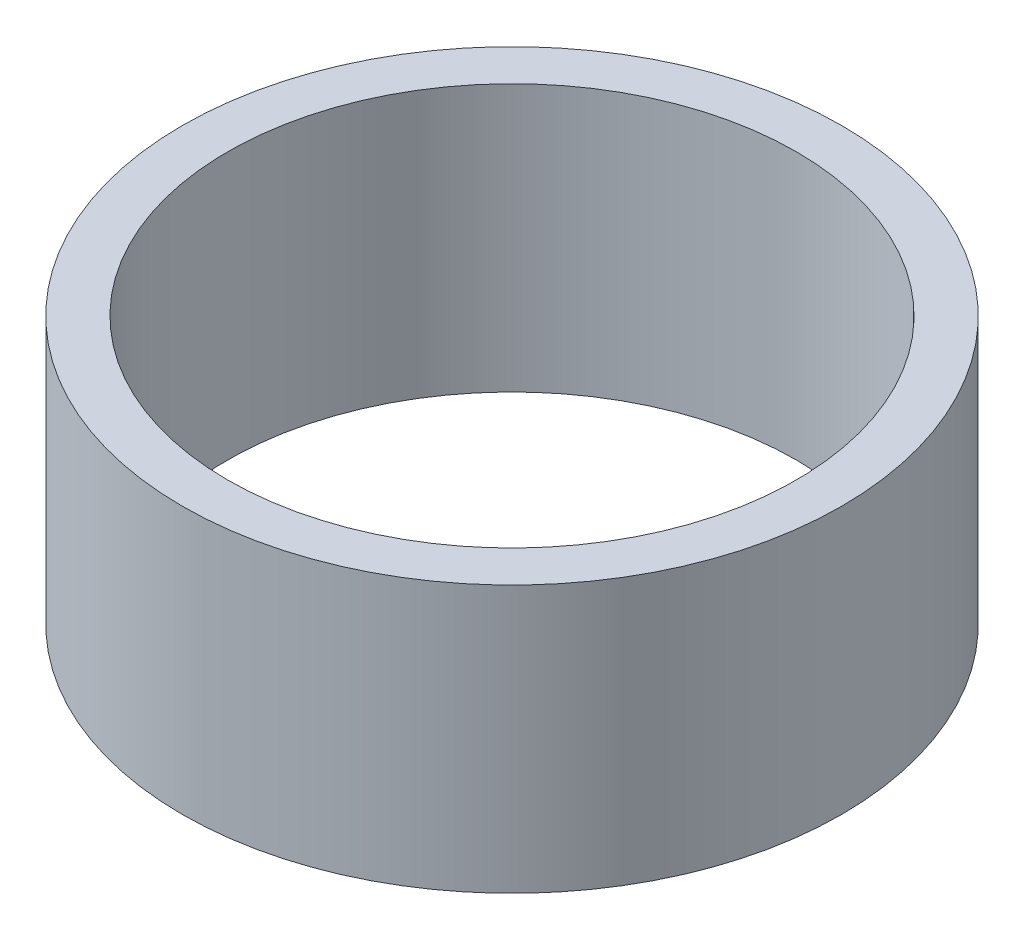
ISO-10303-21;
HEADER;
FILE_DESCRIPTION(('STEP AP214'),'2;1');
FILE_NAME('part.step','',(''),(''),'','','');
FILE_SCHEMA(('AUTOMOTIVE_DESIGN { 1 0 10303 214 1 1 1 1 }'));
ENDSEC;
DATA;
#1=APPLICATION_CONTEXT('core data for automotive mechanical design processes');
#2=APPLICATION_PROTOCOL_DEFINITION('international standard','automotive_design',2000,#1);
#3=PRODUCT_CONTEXT('',#1,'mechanical');
#4=PRODUCT('Part','Part','',(#3));
#5=PRODUCT_RELATED_PRODUCT_CATEGORY('part','',(#4));
#6=PRODUCT_DEFINITION_FORMATION('','',#4);
#7=PRODUCT_DEFINITION_CONTEXT('part definition',#1,'design');
#8=PRODUCT_DEFINITION('design','',#6,#7);
#9=PRODUCT_DEFINITION_SHAPE('','',#8);
#10=(LENGTH_UNIT() NAMED_UNIT(*) SI_UNIT(.MILLI.,.METRE.));
#11=(NAMED_UNIT(*) PLANE_ANGLE_UNIT() SI_UNIT($,.RADIAN.));
#12=(NAMED_UNIT(*) SI_UNIT($,.STERADIAN.) SOLID_ANGLE_UNIT());
#13=UNCERTAINTY_MEASURE_WITH_UNIT(LENGTH_MEASURE(1.E-05),#10,'distance_accuracy_value','');
#14=(GEOMETRIC_REPRESENTATION_CONTEXT(3) GLOBAL_UNCERTAINTY_ASSIGNED_CONTEXT((#13)) GLOBAL_UNIT_ASSIGNED_CONTEXT((#10,
#11,#12)) REPRESENTATION_CONTEXT('',''));
#15=CARTESIAN_POINT('',(0.,0.,0.));
#16=DIRECTION('',(0.,0.,1.));
#17=DIRECTION('',(1.,0.,0.));
#18=AXIS2_PLACEMENT_3D('',#15,#16,#17);
#19=CARTESIAN_POINT('',(0.,10.,0.));
#20=DIRECTION('',(0.,1.,0.));
#21=DIRECTION('',(0.,0.,1.));
#22=AXIS2_PLACEMENT_3D('',#19,#20,#21);
#23=PLANE('',#22);
#24=CARTESIAN_POINT('',(0.,10.,0.));
#25=DIRECTION('',(0.,1.,0.));
#26=DIRECTION('',(0.,0.,1.));
#27=AXIS2_PLACEMENT_3D('',#24,#25,#26);
#28=CIRCLE('',#27,12.35);
#29=CARTESIAN_POINT('',(0.,10.,12.35));
#30=VERTEX_POINT('',#29);
#31=EDGE_CURVE('E10',#30,#30,#28,.T.);
#32=ORIENTED_EDGE('',*,*,#31,.T.);
#33=EDGE_LOOP('',(#32));
#34=FACE_BOUND('',#33,.T.);
#35=CARTESIAN_POINT('',(0.,10.,0.));
#36=DIRECTION('',(0.,1.,0.));
#37=DIRECTION('',(0.,0.,1.));
#38=AXIS2_PLACEMENT_3D('',#35,#36,#37);
#39=CIRCLE('',#38,10.65);
#40=CARTESIAN_POINT('',(0.,10.,10.65));
#41=VERTEX_POINT('',#40);
#42=EDGE_CURVE('E50',#41,#41,#39,.T.);
#43=ORIENTED_EDGE('',*,*,#42,.F.);
#44=EDGE_LOOP('',(#43));
#45=FACE_BOUND('',#44,.T.);
#46=ADVANCED_FACE('F37',(#34,#45),#23,.T.);
#47=CARTESIAN_POINT('',(0.,0.,0.));
#48=DIRECTION('',(0.,1.,0.));
#49=DIRECTION('',(0.,0.,1.));
#50=AXIS2_PLACEMENT_3D('',#47,#48,#49);
#51=PLANE('',#50);
#52=CARTESIAN_POINT('',(0.,0.,0.));
#53=DIRECTION('',(0.,1.,0.));
#54=DIRECTION('',(0.,0.,1.));
#55=AXIS2_PLACEMENT_3D('',#52,#53,#54);
#56=CIRCLE('',#55,12.35);
#57=CARTESIAN_POINT('',(0.,0.,12.35));
#58=VERTEX_POINT('',#57);
#59=EDGE_CURVE('E41',#58,#58,#56,.T.);
#60=ORIENTED_EDGE('',*,*,#59,.F.);
#61=EDGE_LOOP('',(#60));
#62=FACE_BOUND('',#61,.T.);
#63=CARTESIAN_POINT('',(0.,0.,0.));
#64=DIRECTION('',(0.,1.,0.));
#65=DIRECTION('',(0.,0.,1.));
#66=AXIS2_PLACEMENT_3D('',#63,#64,#65);
#67=CIRCLE('',#66,10.65);
#68=CARTESIAN_POINT('',(0.,0.,10.65));
#69=VERTEX_POINT('',#68);
#70=EDGE_CURVE('E52',#69,#69,#67,.T.);
#71=ORIENTED_EDGE('',*,*,#70,.T.);
#72=EDGE_LOOP('',(#71));
#73=FACE_BOUND('',#72,.T.);
#74=ADVANCED_FACE('F64',(#62,#73),#51,.F.);
#75=CARTESIAN_POINT('',(0.,10.,0.));
#76=DIRECTION('',(0.,-1.,0.));
#77=DIRECTION('',(0.,0.,-1.));
#78=AXIS2_PLACEMENT_3D('',#75,#76,#77);
#79=CYLINDRICAL_SURFACE('',#78,12.35);
#80=ORIENTED_EDGE('',*,*,#31,.F.);
#81=EDGE_LOOP('',(#80));
#82=FACE_BOUND('',#81,.T.);
#83=ORIENTED_EDGE('',*,*,#59,.T.);
#84=EDGE_LOOP('',(#83));
#85=FACE_BOUND('',#84,.T.);
#86=ADVANCED_FACE('F39',(#82,#85),#79,.T.);
#87=CARTESIAN_POINT('',(0.,10.,0.));
#88=DIRECTION('',(0.,-1.,0.));
#89=DIRECTION('',(0.,0.,-1.));
#90=AXIS2_PLACEMENT_3D('',#87,#88,#89);
#91=CYLINDRICAL_SURFACE('',#90,10.65);
#92=ORIENTED_EDGE('',*,*,#42,.T.);
#93=EDGE_LOOP('',(#92));
#94=FACE_BOUND('',#93,.T.);
#95=ORIENTED_EDGE('',*,*,#70,.F.);
#96=EDGE_LOOP('',(#95));
#97=FACE_BOUND('',#96,.T.);
#98=ADVANCED_FACE('F60',(#94,#97),#91,.F.);
#99=CLOSED_SHELL('',(#46,#74,#86,#98));
#100=MANIFOLD_SOLID_BREP('B2',#99);
#101=ADVANCED_BREP_SHAPE_REPRESENTATION('',(#18,#100),#14);
#102=SHAPE_DEFINITION_REPRESENTATION(#9,#101);
ENDSEC;
END-ISO-10303-21;
